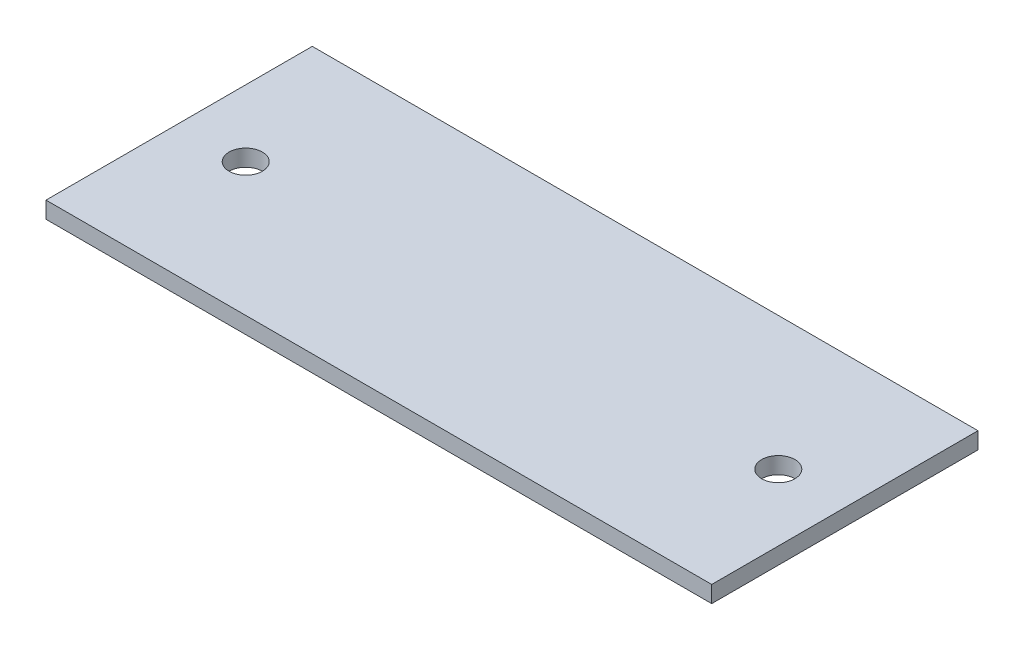
ISO-10303-21;
HEADER;
FILE_DESCRIPTION(('STEP AP214'),'2;1');
FILE_NAME('part.step','',(''),(''),'','','');
FILE_SCHEMA(('AUTOMOTIVE_DESIGN { 1 0 10303 214 1 1 1 1 }'));
ENDSEC;
DATA;
#1=APPLICATION_CONTEXT('core data for automotive mechanical design processes');
#2=APPLICATION_PROTOCOL_DEFINITION('international standard','automotive_design',2000,#1);
#3=PRODUCT_CONTEXT('',#1,'mechanical');
#4=PRODUCT('Part','Part','',(#3));
#5=PRODUCT_RELATED_PRODUCT_CATEGORY('part','',(#4));
#6=PRODUCT_DEFINITION_FORMATION('','',#4);
#7=PRODUCT_DEFINITION_CONTEXT('part definition',#1,'design');
#8=PRODUCT_DEFINITION('design','',#6,#7);
#9=PRODUCT_DEFINITION_SHAPE('','',#8);
#10=(LENGTH_UNIT() NAMED_UNIT(*) SI_UNIT(.MILLI.,.METRE.));
#11=(NAMED_UNIT(*) PLANE_ANGLE_UNIT() SI_UNIT($,.RADIAN.));
#12=(NAMED_UNIT(*) SI_UNIT($,.STERADIAN.) SOLID_ANGLE_UNIT());
#13=UNCERTAINTY_MEASURE_WITH_UNIT(LENGTH_MEASURE(1.E-05),#10,'distance_accuracy_value','');
#14=(GEOMETRIC_REPRESENTATION_CONTEXT(3) GLOBAL_UNCERTAINTY_ASSIGNED_CONTEXT((#13)) GLOBAL_UNIT_ASSIGNED_CONTEXT((#10,
#11,#12)) REPRESENTATION_CONTEXT('',''));
#15=CARTESIAN_POINT('',(0.,0.,0.));
#16=DIRECTION('',(0.,0.,1.));
#17=DIRECTION('',(1.,0.,0.));
#18=AXIS2_PLACEMENT_3D('',#15,#16,#17);
#19=CARTESIAN_POINT('',(0.,3.175,0.));
#20=DIRECTION('',(1.,0.,0.));
#21=DIRECTION('',(0.,0.,-1.));
#22=AXIS2_PLACEMENT_3D('',#19,#20,#21);
#23=PLANE('',#22);
#24=DIRECTION('',(0.,0.,1.));
#25=VECTOR('',#24,1.);
#26=CARTESIAN_POINT('',(0.,0.,0.));
#27=LINE('',#26,#25);
#28=CARTESIAN_POINT('',(0.,0.,-50.8));
#29=VERTEX_POINT('',#28);
#30=CARTESIAN_POINT('',(0.,0.,0.));
#31=VERTEX_POINT('',#30);
#32=EDGE_CURVE('E100',#29,#31,#27,.T.);
#33=ORIENTED_EDGE('',*,*,#32,.T.);
#34=DIRECTION('',(0.,-1.,0.));
#35=VECTOR('',#34,1.);
#36=CARTESIAN_POINT('',(0.,3.175,0.));
#37=LINE('',#36,#35);
#38=CARTESIAN_POINT('',(0.,3.175,0.));
#39=VERTEX_POINT('',#38);
#40=EDGE_CURVE('E11',#39,#31,#37,.T.);
#41=ORIENTED_EDGE('',*,*,#40,.F.);
#42=DIRECTION('',(0.,0.,1.));
#43=VECTOR('',#42,1.);
#44=CARTESIAN_POINT('',(0.,3.175,0.));
#45=LINE('',#44,#43);
#46=CARTESIAN_POINT('',(0.,3.175,-50.8));
#47=VERTEX_POINT('',#46);
#48=EDGE_CURVE('E87',#47,#39,#45,.T.);
#49=ORIENTED_EDGE('',*,*,#48,.F.);
#50=DIRECTION('',(0.,-1.,0.));
#51=VECTOR('',#50,1.);
#52=CARTESIAN_POINT('',(0.,3.175,-50.8));
#53=LINE('',#52,#51);
#54=EDGE_CURVE('E96',#47,#29,#53,.T.);
#55=ORIENTED_EDGE('',*,*,#54,.T.);
#56=EDGE_LOOP('',(#33,#41,#49,#55));
#57=FACE_BOUND('',#56,.T.);
#58=ADVANCED_FACE('F36',(#57),#23,.F.);
#59=CARTESIAN_POINT('',(0.,3.175,0.));
#60=DIRECTION('',(0.,0.,-1.));
#61=DIRECTION('',(-1.,0.,0.));
#62=AXIS2_PLACEMENT_3D('',#59,#60,#61);
#63=PLANE('',#62);
#64=DIRECTION('',(1.,0.,0.));
#65=VECTOR('',#64,1.);
#66=CARTESIAN_POINT('',(0.,0.,0.));
#67=LINE('',#66,#65);
#68=CARTESIAN_POINT('',(127.,0.,0.));
#69=VERTEX_POINT('',#68);
#70=EDGE_CURVE('E92',#31,#69,#67,.T.);
#71=ORIENTED_EDGE('',*,*,#70,.T.);
#72=DIRECTION('',(0.,-1.,0.));
#73=VECTOR('',#72,1.);
#74=CARTESIAN_POINT('',(127.,3.175,0.));
#75=LINE('',#74,#73);
#76=CARTESIAN_POINT('',(127.,3.175,0.));
#77=VERTEX_POINT('',#76);
#78=EDGE_CURVE('E44',#77,#69,#75,.T.);
#79=ORIENTED_EDGE('',*,*,#78,.F.);
#80=DIRECTION('',(1.,0.,0.));
#81=VECTOR('',#80,1.);
#82=CARTESIAN_POINT('',(0.,3.175,0.));
#83=LINE('',#82,#81);
#84=EDGE_CURVE('E82',#39,#77,#83,.T.);
#85=ORIENTED_EDGE('',*,*,#84,.F.);
#86=ORIENTED_EDGE('',*,*,#40,.T.);
#87=EDGE_LOOP('',(#71,#79,#85,#86));
#88=FACE_BOUND('',#87,.T.);
#89=ADVANCED_FACE('F91',(#88),#63,.F.);
#90=CARTESIAN_POINT('',(127.,3.175,0.));
#91=DIRECTION('',(-1.,0.,0.));
#92=DIRECTION('',(0.,0.,1.));
#93=AXIS2_PLACEMENT_3D('',#90,#91,#92);
#94=PLANE('',#93);
#95=DIRECTION('',(0.,0.,-1.));
#96=VECTOR('',#95,1.);
#97=CARTESIAN_POINT('',(127.,0.,0.));
#98=LINE('',#97,#96);
#99=CARTESIAN_POINT('',(127.,0.,-50.8));
#100=VERTEX_POINT('',#99);
#101=EDGE_CURVE('E69',#69,#100,#98,.T.);
#102=ORIENTED_EDGE('',*,*,#101,.T.);
#103=DIRECTION('',(0.,-1.,0.));
#104=VECTOR('',#103,1.);
#105=CARTESIAN_POINT('',(127.,3.175,-50.8));
#106=LINE('',#105,#104);
#107=CARTESIAN_POINT('',(127.,3.175,-50.8));
#108=VERTEX_POINT('',#107);
#109=EDGE_CURVE('E93',#108,#100,#106,.T.);
#110=ORIENTED_EDGE('',*,*,#109,.F.);
#111=DIRECTION('',(0.,0.,-1.));
#112=VECTOR('',#111,1.);
#113=CARTESIAN_POINT('',(127.,3.175,0.));
#114=LINE('',#113,#112);
#115=EDGE_CURVE('E85',#77,#108,#114,.T.);
#116=ORIENTED_EDGE('',*,*,#115,.F.);
#117=ORIENTED_EDGE('',*,*,#78,.T.);
#118=EDGE_LOOP('',(#102,#110,#116,#117));
#119=FACE_BOUND('',#118,.T.);
#120=ADVANCED_FACE('F94',(#119),#94,.F.);
#121=CARTESIAN_POINT('',(0.,3.175,-50.8));
#122=DIRECTION('',(0.,0.,1.));
#123=DIRECTION('',(1.,0.,0.));
#124=AXIS2_PLACEMENT_3D('',#121,#122,#123);
#125=PLANE('',#124);
#126=DIRECTION('',(-1.,0.,0.));
#127=VECTOR('',#126,1.);
#128=CARTESIAN_POINT('',(0.,0.,-50.8));
#129=LINE('',#128,#127);
#130=EDGE_CURVE('E75',#100,#29,#129,.T.);
#131=ORIENTED_EDGE('',*,*,#130,.T.);
#132=ORIENTED_EDGE('',*,*,#54,.F.);
#133=DIRECTION('',(-1.,0.,0.));
#134=VECTOR('',#133,1.);
#135=CARTESIAN_POINT('',(0.,3.175,-50.8));
#136=LINE('',#135,#134);
#137=EDGE_CURVE('E52',#108,#47,#136,.T.);
#138=ORIENTED_EDGE('',*,*,#137,.F.);
#139=ORIENTED_EDGE('',*,*,#109,.T.);
#140=EDGE_LOOP('',(#131,#132,#138,#139));
#141=FACE_BOUND('',#140,.T.);
#142=ADVANCED_FACE('F108',(#141),#125,.F.);
#143=CARTESIAN_POINT('',(0.,3.175,0.));
#144=DIRECTION('',(0.,-1.,0.));
#145=DIRECTION('',(0.,0.,-1.));
#146=AXIS2_PLACEMENT_3D('',#143,#144,#145);
#147=PLANE('',#146);
#148=CARTESIAN_POINT('',(12.7,3.175,-25.4));
#149=DIRECTION('',(0.,-1.,0.));
#150=DIRECTION('',(0.,0.,-1.));
#151=AXIS2_PLACEMENT_3D('',#148,#149,#150);
#152=CIRCLE('',#151,3.175);
#153=CARTESIAN_POINT('',(12.7,3.175,-28.575));
#154=VERTEX_POINT('',#153);
#155=EDGE_CURVE('E119',#154,#154,#152,.T.);
#156=ORIENTED_EDGE('',*,*,#155,.T.);
#157=EDGE_LOOP('',(#156));
#158=FACE_BOUND('',#157,.T.);
#159=CARTESIAN_POINT('',(114.3,3.175,-25.4));
#160=DIRECTION('',(0.,-1.,0.));
#161=DIRECTION('',(0.,0.,-1.));
#162=AXIS2_PLACEMENT_3D('',#159,#160,#161);
#163=CIRCLE('',#162,3.17499999999997);
#164=CARTESIAN_POINT('',(114.3,3.175,-28.575));
#165=VERTEX_POINT('',#164);
#166=EDGE_CURVE('E103',#165,#165,#163,.T.);
#167=ORIENTED_EDGE('',*,*,#166,.T.);
#168=EDGE_LOOP('',(#167));
#169=FACE_BOUND('',#168,.T.);
#170=ORIENTED_EDGE('',*,*,#48,.T.);
#171=ORIENTED_EDGE('',*,*,#84,.T.);
#172=ORIENTED_EDGE('',*,*,#115,.T.);
#173=ORIENTED_EDGE('',*,*,#137,.T.);
#174=EDGE_LOOP('',(#170,#171,#172,#173));
#175=FACE_BOUND('',#174,.T.);
#176=ADVANCED_FACE('F83',(#158,#169,#175),#147,.F.);
#177=CARTESIAN_POINT('',(0.,0.,0.));
#178=DIRECTION('',(0.,-1.,0.));
#179=DIRECTION('',(0.,0.,-1.));
#180=AXIS2_PLACEMENT_3D('',#177,#178,#179);
#181=PLANE('',#180);
#182=CARTESIAN_POINT('',(12.7,0.,-25.4));
#183=DIRECTION('',(0.,-1.,0.));
#184=DIRECTION('',(0.,0.,-1.));
#185=AXIS2_PLACEMENT_3D('',#182,#183,#184);
#186=CIRCLE('',#185,3.175);
#187=CARTESIAN_POINT('',(12.7,0.,-28.575));
#188=VERTEX_POINT('',#187);
#189=EDGE_CURVE('E123',#188,#188,#186,.T.);
#190=ORIENTED_EDGE('',*,*,#189,.F.);
#191=EDGE_LOOP('',(#190));
#192=FACE_BOUND('',#191,.T.);
#193=CARTESIAN_POINT('',(114.3,0.,-25.4));
#194=DIRECTION('',(0.,-1.,0.));
#195=DIRECTION('',(0.,0.,-1.));
#196=AXIS2_PLACEMENT_3D('',#193,#194,#195);
#197=CIRCLE('',#196,3.17499999999997);
#198=CARTESIAN_POINT('',(114.3,0.,-28.575));
#199=VERTEX_POINT('',#198);
#200=EDGE_CURVE('E116',#199,#199,#197,.T.);
#201=ORIENTED_EDGE('',*,*,#200,.F.);
#202=EDGE_LOOP('',(#201));
#203=FACE_BOUND('',#202,.T.);
#204=ORIENTED_EDGE('',*,*,#32,.F.);
#205=ORIENTED_EDGE('',*,*,#130,.F.);
#206=ORIENTED_EDGE('',*,*,#101,.F.);
#207=ORIENTED_EDGE('',*,*,#70,.F.);
#208=EDGE_LOOP('',(#204,#205,#206,#207));
#209=FACE_BOUND('',#208,.T.);
#210=ADVANCED_FACE('F111',(#192,#203,#209),#181,.T.);
#211=CARTESIAN_POINT('',(114.3,24.638,-25.4));
#212=DIRECTION('',(0.,-1.,0.));
#213=DIRECTION('',(0.,0.,-1.));
#214=AXIS2_PLACEMENT_3D('',#211,#212,#213);
#215=CYLINDRICAL_SURFACE('',#214,3.17499999999997);
#216=ORIENTED_EDGE('',*,*,#200,.T.);
#217=EDGE_LOOP('',(#216));
#218=FACE_BOUND('',#217,.T.);
#219=ORIENTED_EDGE('',*,*,#166,.F.);
#220=EDGE_LOOP('',(#219));
#221=FACE_BOUND('',#220,.T.);
#222=ADVANCED_FACE('F132',(#218,#221),#215,.F.);
#223=CARTESIAN_POINT('',(12.7,24.638,-25.4));
#224=DIRECTION('',(0.,-1.,0.));
#225=DIRECTION('',(0.,0.,-1.));
#226=AXIS2_PLACEMENT_3D('',#223,#224,#225);
#227=CYLINDRICAL_SURFACE('',#226,3.175);
#228=ORIENTED_EDGE('',*,*,#189,.T.);
#229=EDGE_LOOP('',(#228));
#230=FACE_BOUND('',#229,.T.);
#231=ORIENTED_EDGE('',*,*,#155,.F.);
#232=EDGE_LOOP('',(#231));
#233=FACE_BOUND('',#232,.T.);
#234=ADVANCED_FACE('F127',(#230,#233),#227,.F.);
#235=CLOSED_SHELL('',(#58,#89,#120,#142,#176,#210,#222,#234));
#236=MANIFOLD_SOLID_BREP('B2',#235);
#237=ADVANCED_BREP_SHAPE_REPRESENTATION('',(#18,#236),#14);
#238=SHAPE_DEFINITION_REPRESENTATION(#9,#237);
ENDSEC;
END-ISO-10303-21;
